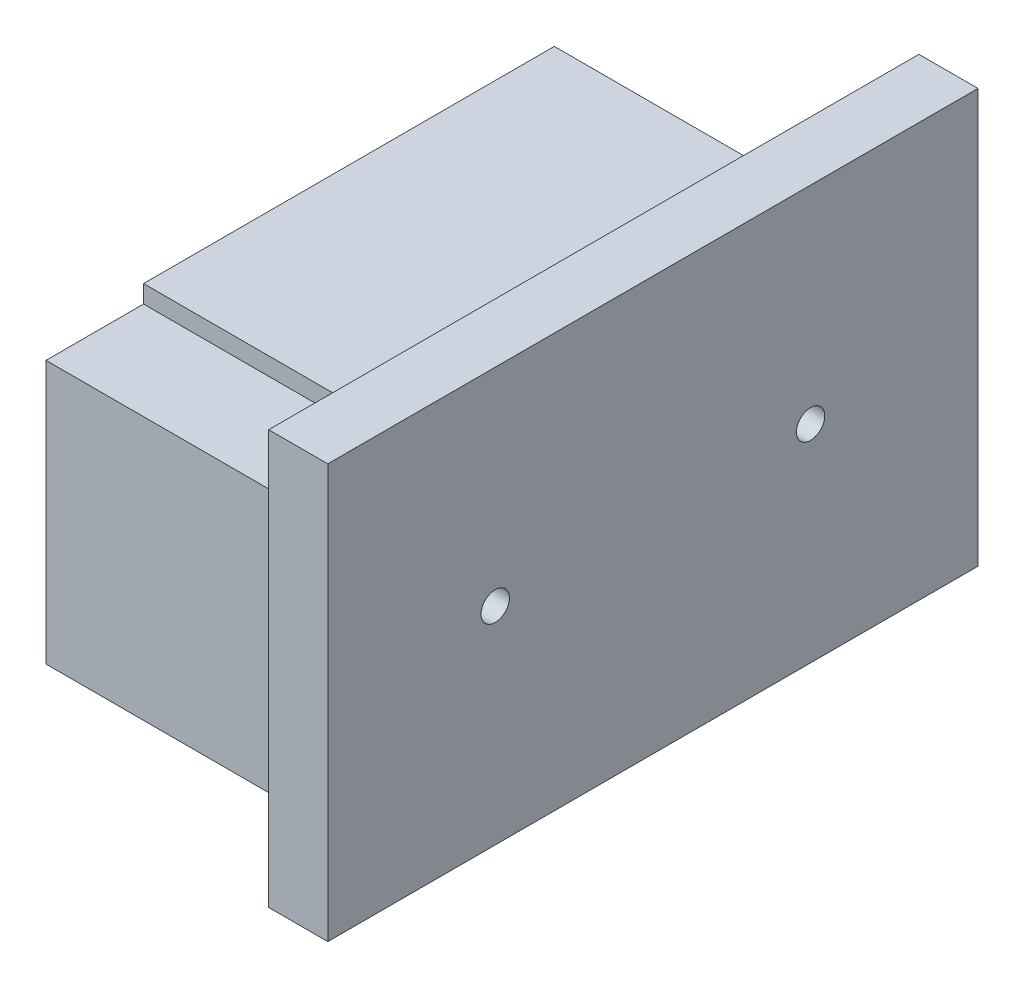
ISO-10303-21;
HEADER;
FILE_DESCRIPTION(('STEP AP214'),'2;1');
FILE_NAME('part.step','',(''),(''),'','','');
FILE_SCHEMA(('AUTOMOTIVE_DESIGN { 1 0 10303 214 1 1 1 1 }'));
ENDSEC;
DATA;
#1=APPLICATION_CONTEXT('core data for automotive mechanical design processes');
#2=APPLICATION_PROTOCOL_DEFINITION('international standard','automotive_design',2000,#1);
#3=PRODUCT_CONTEXT('',#1,'mechanical');
#4=PRODUCT('Part','Part','',(#3));
#5=PRODUCT_RELATED_PRODUCT_CATEGORY('part','',(#4));
#6=PRODUCT_DEFINITION_FORMATION('','',#4);
#7=PRODUCT_DEFINITION_CONTEXT('part definition',#1,'design');
#8=PRODUCT_DEFINITION('design','',#6,#7);
#9=PRODUCT_DEFINITION_SHAPE('','',#8);
#10=(LENGTH_UNIT() NAMED_UNIT(*) SI_UNIT(.MILLI.,.METRE.));
#11=(NAMED_UNIT(*) PLANE_ANGLE_UNIT() SI_UNIT($,.RADIAN.));
#12=(NAMED_UNIT(*) SI_UNIT($,.STERADIAN.) SOLID_ANGLE_UNIT());
#13=UNCERTAINTY_MEASURE_WITH_UNIT(LENGTH_MEASURE(1.E-05),#10,'distance_accuracy_value','');
#14=(GEOMETRIC_REPRESENTATION_CONTEXT(3) GLOBAL_UNCERTAINTY_ASSIGNED_CONTEXT((#13)) GLOBAL_UNIT_ASSIGNED_CONTEXT((#10,
#11,#12)) REPRESENTATION_CONTEXT('',''));
#15=CARTESIAN_POINT('',(0.,0.,0.));
#16=DIRECTION('',(0.,0.,1.));
#17=DIRECTION('',(1.,0.,0.));
#18=AXIS2_PLACEMENT_3D('',#15,#16,#17);
#19=CARTESIAN_POINT('',(32.,-10.5,0.));
#20=DIRECTION('',(0.,1.,0.));
#21=DIRECTION('',(0.,0.,1.));
#22=AXIS2_PLACEMENT_3D('',#19,#20,#21);
#23=PLANE('',#22);
#24=DIRECTION('',(0.,0.,-1.));
#25=VECTOR('',#24,1.);
#26=CARTESIAN_POINT('',(22.,-10.5,0.));
#27=LINE('',#26,#25);
#28=CARTESIAN_POINT('',(22.,-10.5,53.325));
#29=VERTEX_POINT('',#28);
#30=CARTESIAN_POINT('',(22.,-10.5,-56.675));
#31=VERTEX_POINT('',#30);
#32=EDGE_CURVE('E152',#29,#31,#27,.T.);
#33=ORIENTED_EDGE('',*,*,#32,.T.);
#34=DIRECTION('',(-1.,0.,0.));
#35=VECTOR('',#34,1.);
#36=CARTESIAN_POINT('',(32.,-10.5,-56.675));
#37=LINE('',#36,#35);
#38=CARTESIAN_POINT('',(32.,-10.5,-56.675));
#39=VERTEX_POINT('',#38);
#40=EDGE_CURVE('E13',#39,#31,#37,.T.);
#41=ORIENTED_EDGE('',*,*,#40,.F.);
#42=DIRECTION('',(0.,0.,-1.));
#43=VECTOR('',#42,1.);
#44=CARTESIAN_POINT('',(32.,-10.5,0.));
#45=LINE('',#44,#43);
#46=CARTESIAN_POINT('',(32.,-10.5,53.325));
#47=VERTEX_POINT('',#46);
#48=EDGE_CURVE('E99',#47,#39,#45,.T.);
#49=ORIENTED_EDGE('',*,*,#48,.F.);
#50=DIRECTION('',(-1.,0.,0.));
#51=VECTOR('',#50,1.);
#52=CARTESIAN_POINT('',(32.,-10.5,53.325));
#53=LINE('',#52,#51);
#54=EDGE_CURVE('E66',#47,#29,#53,.T.);
#55=ORIENTED_EDGE('',*,*,#54,.T.);
#56=EDGE_LOOP('',(#33,#41,#49,#55));
#57=FACE_BOUND('',#56,.T.);
#58=ADVANCED_FACE('F48',(#57),#23,.F.);
#59=CARTESIAN_POINT('',(32.,0.,-56.675));
#60=DIRECTION('',(0.,0.,1.));
#61=DIRECTION('',(1.,0.,0.));
#62=AXIS2_PLACEMENT_3D('',#59,#60,#61);
#63=PLANE('',#62);
#64=DIRECTION('',(0.,1.,0.));
#65=VECTOR('',#64,1.);
#66=CARTESIAN_POINT('',(22.,0.,-56.675));
#67=LINE('',#66,#65);
#68=CARTESIAN_POINT('',(22.,59.5,-56.675));
#69=VERTEX_POINT('',#68);
#70=EDGE_CURVE('E104',#31,#69,#67,.T.);
#71=ORIENTED_EDGE('',*,*,#70,.T.);
#72=DIRECTION('',(-1.,0.,0.));
#73=VECTOR('',#72,1.);
#74=CARTESIAN_POINT('',(32.,59.5,-56.675));
#75=LINE('',#74,#73);
#76=CARTESIAN_POINT('',(32.,59.5,-56.675));
#77=VERTEX_POINT('',#76);
#78=EDGE_CURVE('E57',#77,#69,#75,.T.);
#79=ORIENTED_EDGE('',*,*,#78,.F.);
#80=DIRECTION('',(0.,1.,0.));
#81=VECTOR('',#80,1.);
#82=CARTESIAN_POINT('',(32.,0.,-56.675));
#83=LINE('',#82,#81);
#84=EDGE_CURVE('E91',#39,#77,#83,.T.);
#85=ORIENTED_EDGE('',*,*,#84,.F.);
#86=ORIENTED_EDGE('',*,*,#40,.T.);
#87=EDGE_LOOP('',(#71,#79,#85,#86));
#88=FACE_BOUND('',#87,.T.);
#89=ADVANCED_FACE('F103',(#88),#63,.F.);
#90=CARTESIAN_POINT('',(32.,59.5,0.));
#91=DIRECTION('',(0.,1.,0.));
#92=DIRECTION('',(0.,0.,1.));
#93=AXIS2_PLACEMENT_3D('',#90,#91,#92);
#94=PLANE('',#93);
#95=DIRECTION('',(0.,0.,-1.));
#96=VECTOR('',#95,1.);
#97=CARTESIAN_POINT('',(22.,59.5,0.));
#98=LINE('',#97,#96);
#99=CARTESIAN_POINT('',(22.,59.5,53.325));
#100=VERTEX_POINT('',#99);
#101=EDGE_CURVE('E155',#100,#69,#98,.T.);
#102=ORIENTED_EDGE('',*,*,#101,.F.);
#103=DIRECTION('',(-1.,0.,0.));
#104=VECTOR('',#103,1.);
#105=CARTESIAN_POINT('',(32.,59.5,53.325));
#106=LINE('',#105,#104);
#107=CARTESIAN_POINT('',(32.,59.5,53.325));
#108=VERTEX_POINT('',#107);
#109=EDGE_CURVE('E80',#108,#100,#106,.T.);
#110=ORIENTED_EDGE('',*,*,#109,.F.);
#111=DIRECTION('',(0.,0.,-1.));
#112=VECTOR('',#111,1.);
#113=CARTESIAN_POINT('',(32.,59.5,0.));
#114=LINE('',#113,#112);
#115=EDGE_CURVE('E98',#108,#77,#114,.T.);
#116=ORIENTED_EDGE('',*,*,#115,.T.);
#117=ORIENTED_EDGE('',*,*,#78,.T.);
#118=EDGE_LOOP('',(#102,#110,#116,#117));
#119=FACE_BOUND('',#118,.T.);
#120=ADVANCED_FACE('F108',(#119),#94,.T.);
#121=CARTESIAN_POINT('',(32.,0.,53.325));
#122=DIRECTION('',(0.,0.,1.));
#123=DIRECTION('',(1.,0.,0.));
#124=AXIS2_PLACEMENT_3D('',#121,#122,#123);
#125=PLANE('',#124);
#126=DIRECTION('',(0.,1.,0.));
#127=VECTOR('',#126,1.);
#128=CARTESIAN_POINT('',(22.,0.,53.325));
#129=LINE('',#128,#127);
#130=EDGE_CURVE('E122',#29,#100,#129,.T.);
#131=ORIENTED_EDGE('',*,*,#130,.F.);
#132=ORIENTED_EDGE('',*,*,#54,.F.);
#133=DIRECTION('',(0.,1.,0.));
#134=VECTOR('',#133,1.);
#135=CARTESIAN_POINT('',(32.,0.,53.325));
#136=LINE('',#135,#134);
#137=EDGE_CURVE('E109',#47,#108,#136,.T.);
#138=ORIENTED_EDGE('',*,*,#137,.T.);
#139=ORIENTED_EDGE('',*,*,#109,.T.);
#140=EDGE_LOOP('',(#131,#132,#138,#139));
#141=FACE_BOUND('',#140,.T.);
#142=ADVANCED_FACE('F162',(#141),#125,.T.);
#143=CARTESIAN_POINT('',(32.,0.,0.));
#144=DIRECTION('',(1.,0.,0.));
#145=DIRECTION('',(0.,0.,-1.));
#146=AXIS2_PLACEMENT_3D('',#143,#144,#145);
#147=PLANE('',#146);
#148=CARTESIAN_POINT('',(32.,24.5,-28.35));
#149=DIRECTION('',(1.,0.,0.));
#150=DIRECTION('',(0.,0.,-1.));
#151=AXIS2_PLACEMENT_3D('',#148,#149,#150);
#152=CIRCLE('',#151,2.4);
#153=CARTESIAN_POINT('',(32.,24.5,-30.75));
#154=VERTEX_POINT('',#153);
#155=EDGE_CURVE('E128',#154,#154,#152,.T.);
#156=ORIENTED_EDGE('',*,*,#155,.F.);
#157=EDGE_LOOP('',(#156));
#158=FACE_BOUND('',#157,.T.);
#159=CARTESIAN_POINT('',(32.,24.5,25.));
#160=DIRECTION('',(1.,0.,0.));
#161=DIRECTION('',(0.,0.,-1.));
#162=AXIS2_PLACEMENT_3D('',#159,#160,#161);
#163=CIRCLE('',#162,2.4);
#164=CARTESIAN_POINT('',(32.,24.5,22.6));
#165=VERTEX_POINT('',#164);
#166=EDGE_CURVE('E123',#165,#165,#163,.T.);
#167=ORIENTED_EDGE('',*,*,#166,.F.);
#168=EDGE_LOOP('',(#167));
#169=FACE_BOUND('',#168,.T.);
#170=ORIENTED_EDGE('',*,*,#48,.T.);
#171=ORIENTED_EDGE('',*,*,#84,.T.);
#172=ORIENTED_EDGE('',*,*,#115,.F.);
#173=ORIENTED_EDGE('',*,*,#137,.F.);
#174=EDGE_LOOP('',(#170,#171,#172,#173));
#175=FACE_BOUND('',#174,.T.);
#176=ADVANCED_FACE('F95',(#158,#169,#175),#147,.T.);
#177=CARTESIAN_POINT('',(22.,0.,0.));
#178=DIRECTION('',(1.,0.,0.));
#179=DIRECTION('',(0.,0.,-1.));
#180=AXIS2_PLACEMENT_3D('',#177,#178,#179);
#181=PLANE('',#180);
#182=CARTESIAN_POINT('',(22.,24.5,-28.35));
#183=DIRECTION('',(1.,0.,0.));
#184=DIRECTION('',(0.,0.,-1.));
#185=AXIS2_PLACEMENT_3D('',#182,#183,#184);
#186=CIRCLE('',#185,2.4);
#187=CARTESIAN_POINT('',(22.,24.5,-30.75));
#188=VERTEX_POINT('',#187);
#189=EDGE_CURVE('E51',#188,#188,#186,.T.);
#190=ORIENTED_EDGE('',*,*,#189,.T.);
#191=EDGE_LOOP('',(#190));
#192=FACE_BOUND('',#191,.T.);
#193=CARTESIAN_POINT('',(22.,24.5,25.));
#194=DIRECTION('',(1.,0.,0.));
#195=DIRECTION('',(0.,0.,-1.));
#196=AXIS2_PLACEMENT_3D('',#193,#194,#195);
#197=CIRCLE('',#196,2.4);
#198=CARTESIAN_POINT('',(22.,24.5,22.6));
#199=VERTEX_POINT('',#198);
#200=EDGE_CURVE('E127',#199,#199,#197,.T.);
#201=ORIENTED_EDGE('',*,*,#200,.T.);
#202=EDGE_LOOP('',(#201));
#203=FACE_BOUND('',#202,.T.);
#204=ORIENTED_EDGE('',*,*,#32,.F.);
#205=ORIENTED_EDGE('',*,*,#130,.T.);
#206=ORIENTED_EDGE('',*,*,#101,.T.);
#207=ORIENTED_EDGE('',*,*,#70,.F.);
#208=EDGE_LOOP('',(#204,#205,#206,#207));
#209=FACE_BOUND('',#208,.T.);
#210=ADVANCED_FACE('F136',(#192,#203,#209),#181,.F.);
#211=CARTESIAN_POINT('',(-22.,24.5,25.));
#212=DIRECTION('',(1.,0.,0.));
#213=DIRECTION('',(0.,0.,-1.));
#214=AXIS2_PLACEMENT_3D('',#211,#212,#213);
#215=CYLINDRICAL_SURFACE('',#214,2.4);
#216=ORIENTED_EDGE('',*,*,#166,.T.);
#217=EDGE_LOOP('',(#216));
#218=FACE_BOUND('',#217,.T.);
#219=ORIENTED_EDGE('',*,*,#200,.F.);
#220=EDGE_LOOP('',(#219));
#221=FACE_BOUND('',#220,.T.);
#222=ADVANCED_FACE('F141',(#218,#221),#215,.F.);
#223=CARTESIAN_POINT('',(-22.,24.5,-28.35));
#224=DIRECTION('',(1.,0.,0.));
#225=DIRECTION('',(0.,0.,-1.));
#226=AXIS2_PLACEMENT_3D('',#223,#224,#225);
#227=CYLINDRICAL_SURFACE('',#226,2.4);
#228=ORIENTED_EDGE('',*,*,#155,.T.);
#229=EDGE_LOOP('',(#228));
#230=FACE_BOUND('',#229,.T.);
#231=ORIENTED_EDGE('',*,*,#189,.F.);
#232=EDGE_LOOP('',(#231));
#233=FACE_BOUND('',#232,.T.);
#234=ADVANCED_FACE('F139',(#230,#233),#227,.F.);
#235=CLOSED_SHELL('',(#58,#89,#120,#142,#176,#210,#222,#234));
#236=MANIFOLD_SOLID_BREP('B2',#235);
#237=CARTESIAN_POINT('',(-22.,47.5,-47.));
#238=DIRECTION('',(0.,0.,1.));
#239=DIRECTION('',(1.,0.,0.));
#240=AXIS2_PLACEMENT_3D('',#237,#238,#239);
#241=PLANE('',#240);
#242=DIRECTION('',(0.,-1.,0.));
#243=VECTOR('',#242,1.);
#244=CARTESIAN_POINT('',(22.,47.5,-47.));
#245=LINE('',#244,#243);
#246=CARTESIAN_POINT('',(22.,20.8699173563127,-47.));
#247=VERTEX_POINT('',#246);
#248=CARTESIAN_POINT('',(22.,3.,-47.));
#249=VERTEX_POINT('',#248);
#250=EDGE_CURVE('E319',#247,#249,#245,.T.);
#251=ORIENTED_EDGE('',*,*,#250,.T.);
#252=DIRECTION('',(1.,0.,0.));
#253=VECTOR('',#252,1.);
#254=CARTESIAN_POINT('',(-22.,3.,-47.));
#255=LINE('',#254,#253);
#256=CARTESIAN_POINT('',(-22.,3.,-47.));
#257=VERTEX_POINT('',#256);
#258=EDGE_CURVE('E304',#257,#249,#255,.T.);
#259=ORIENTED_EDGE('',*,*,#258,.F.);
#260=DIRECTION('',(0.,-1.,0.));
#261=VECTOR('',#260,1.);
#262=CARTESIAN_POINT('',(-22.,47.5,-47.));
#263=LINE('',#262,#261);
#264=CARTESIAN_POINT('',(-22.,20.8699173563127,-47.));
#265=VERTEX_POINT('',#264);
#266=EDGE_CURVE('E317',#265,#257,#263,.T.);
#267=ORIENTED_EDGE('',*,*,#266,.F.);
#268=DIRECTION('',(1.,0.,0.));
#269=VECTOR('',#268,1.);
#270=CARTESIAN_POINT('',(-22.,20.8699173563127,-47.));
#271=LINE('',#270,#269);
#272=EDGE_CURVE('E335',#265,#247,#271,.T.);
#273=ORIENTED_EDGE('',*,*,#272,.T.);
#274=EDGE_LOOP('',(#251,#259,#267,#273));
#275=FACE_BOUND('',#274,.T.);
#276=ADVANCED_FACE('F223',(#275),#241,.F.);
#277=CARTESIAN_POINT('',(22.,47.5,47.));
#278=DIRECTION('',(-1.,0.,0.));
#279=DIRECTION('',(0.,0.,1.));
#280=AXIS2_PLACEMENT_3D('',#277,#278,#279);
#281=PLANE('',#280);
#282=CARTESIAN_POINT('',(22.,24.5,25.));
#283=DIRECTION('',(1.,0.,0.));
#284=DIRECTION('',(0.,0.,-1.));
#285=AXIS2_PLACEMENT_3D('',#282,#283,#284);
#286=CIRCLE('',#285,19.);
#287=CARTESIAN_POINT('',(22.,24.5,6.));
#288=VERTEX_POINT('',#287);
#289=EDGE_CURVE('E345',#288,#288,#286,.T.);
#290=ORIENTED_EDGE('',*,*,#289,.F.);
#291=EDGE_LOOP('',(#290));
#292=FACE_BOUND('',#291,.T.);
#293=DIRECTION('',(0.,0.,-1.));
#294=VECTOR('',#293,1.);
#295=CARTESIAN_POINT('',(22.,0.,47.));
#296=LINE('',#295,#294);
#297=CARTESIAN_POINT('',(22.,0.,47.));
#298=VERTEX_POINT('',#297);
#299=CARTESIAN_POINT('',(22.,0.,-45.));
#300=VERTEX_POINT('',#299);
#301=EDGE_CURVE('E344',#298,#300,#296,.T.);
#302=ORIENTED_EDGE('',*,*,#301,.T.);
#303=DIRECTION('',(0.,-1.,0.));
#304=VECTOR('',#303,1.);
#305=CARTESIAN_POINT('',(22.,0.,-45.));
#306=LINE('',#305,#304);
#307=CARTESIAN_POINT('',(22.,3.,-45.));
#308=VERTEX_POINT('',#307);
#309=EDGE_CURVE('E248',#308,#300,#306,.T.);
#310=ORIENTED_EDGE('',*,*,#309,.F.);
#311=DIRECTION('',(0.,0.,1.));
#312=VECTOR('',#311,1.);
#313=CARTESIAN_POINT('',(22.,3.,-47.));
#314=LINE('',#313,#312);
#315=EDGE_CURVE('E370',#249,#308,#314,.T.);
#316=ORIENTED_EDGE('',*,*,#315,.F.);
#317=ORIENTED_EDGE('',*,*,#250,.F.);
#318=CARTESIAN_POINT('',(22.,24.5,-28.35));
#319=DIRECTION('',(1.,0.,0.));
#320=DIRECTION('',(0.,0.,-1.));
#321=AXIS2_PLACEMENT_3D('',#318,#319,#320);
#322=CIRCLE('',#321,19.);
#323=CARTESIAN_POINT('',(22.,40.234595641452,-39.));
#324=VERTEX_POINT('',#323);
#325=EDGE_CURVE('E227',#324,#247,#322,.T.);
#326=ORIENTED_EDGE('',*,*,#325,.F.);
#327=DIRECTION('',(0.,-1.,0.));
#328=VECTOR('',#327,1.);
#329=CARTESIAN_POINT('',(22.,47.5,-39.));
#330=LINE('',#329,#328);
#331=CARTESIAN_POINT('',(22.,47.5,-39.));
#332=VERTEX_POINT('',#331);
#333=EDGE_CURVE('E46',#332,#324,#330,.T.);
#334=ORIENTED_EDGE('',*,*,#333,.F.);
#335=DIRECTION('',(0.,0.,-1.));
#336=VECTOR('',#335,1.);
#337=CARTESIAN_POINT('',(22.,47.5,47.));
#338=LINE('',#337,#336);
#339=CARTESIAN_POINT('',(22.,47.5,30.5));
#340=VERTEX_POINT('',#339);
#341=EDGE_CURVE('E350',#340,#332,#338,.T.);
#342=ORIENTED_EDGE('',*,*,#341,.F.);
#343=DIRECTION('',(0.,1.,0.));
#344=VECTOR('',#343,1.);
#345=CARTESIAN_POINT('',(22.,47.5,30.5));
#346=LINE('',#345,#344);
#347=CARTESIAN_POINT('',(22.,44.5,30.5));
#348=VERTEX_POINT('',#347);
#349=EDGE_CURVE('E240',#348,#340,#346,.T.);
#350=ORIENTED_EDGE('',*,*,#349,.F.);
#351=DIRECTION('',(0.,0.,-1.));
#352=VECTOR('',#351,1.);
#353=CARTESIAN_POINT('',(22.,44.5,47.));
#354=LINE('',#353,#352);
#355=CARTESIAN_POINT('',(22.,44.5,47.));
#356=VERTEX_POINT('',#355);
#357=EDGE_CURVE('E373',#356,#348,#354,.T.);
#358=ORIENTED_EDGE('',*,*,#357,.F.);
#359=DIRECTION('',(0.,-1.,0.));
#360=VECTOR('',#359,1.);
#361=CARTESIAN_POINT('',(22.,47.5,47.));
#362=LINE('',#361,#360);
#363=EDGE_CURVE('E334',#356,#298,#362,.T.);
#364=ORIENTED_EDGE('',*,*,#363,.T.);
#365=EDGE_LOOP('',(#302,#310,#316,#317,#326,#334,#342,#350,#358,#364));
#366=FACE_BOUND('',#365,.T.);
#367=ADVANCED_FACE('F225',(#292,#366),#281,.F.);
#368=CARTESIAN_POINT('',(-22.,47.5,47.));
#369=DIRECTION('',(1.,0.,0.));
#370=DIRECTION('',(0.,0.,-1.));
#371=AXIS2_PLACEMENT_3D('',#368,#369,#370);
#372=PLANE('',#371);
#373=CARTESIAN_POINT('',(-22.,24.5,25.));
#374=DIRECTION('',(1.,0.,0.));
#375=DIRECTION('',(0.,0.,-1.));
#376=AXIS2_PLACEMENT_3D('',#373,#374,#375);
#377=CIRCLE('',#376,19.);
#378=CARTESIAN_POINT('',(-22.,24.5,6.));
#379=VERTEX_POINT('',#378);
#380=EDGE_CURVE('E336',#379,#379,#377,.T.);
#381=ORIENTED_EDGE('',*,*,#380,.T.);
#382=EDGE_LOOP('',(#381));
#383=FACE_BOUND('',#382,.T.);
#384=DIRECTION('',(0.,0.,1.));
#385=VECTOR('',#384,1.);
#386=CARTESIAN_POINT('',(-22.,3.,-47.));
#387=LINE('',#386,#385);
#388=CARTESIAN_POINT('',(-22.,3.,-45.));
#389=VERTEX_POINT('',#388);
#390=EDGE_CURVE('E300',#257,#389,#387,.T.);
#391=ORIENTED_EDGE('',*,*,#390,.T.);
#392=DIRECTION('',(0.,-1.,0.));
#393=VECTOR('',#392,1.);
#394=CARTESIAN_POINT('',(-22.,0.,-45.));
#395=LINE('',#394,#393);
#396=CARTESIAN_POINT('',(-22.,0.,-45.));
#397=VERTEX_POINT('',#396);
#398=EDGE_CURVE('E311',#389,#397,#395,.T.);
#399=ORIENTED_EDGE('',*,*,#398,.T.);
#400=DIRECTION('',(0.,0.,1.));
#401=VECTOR('',#400,1.);
#402=CARTESIAN_POINT('',(-22.,0.,47.));
#403=LINE('',#402,#401);
#404=CARTESIAN_POINT('',(-22.,0.,47.));
#405=VERTEX_POINT('',#404);
#406=EDGE_CURVE('E326',#397,#405,#403,.T.);
#407=ORIENTED_EDGE('',*,*,#406,.T.);
#408=DIRECTION('',(0.,-1.,0.));
#409=VECTOR('',#408,1.);
#410=CARTESIAN_POINT('',(-22.,47.5,47.));
#411=LINE('',#410,#409);
#412=CARTESIAN_POINT('',(-22.,44.5,47.));
#413=VERTEX_POINT('',#412);
#414=EDGE_CURVE('E352',#413,#405,#411,.T.);
#415=ORIENTED_EDGE('',*,*,#414,.F.);
#416=DIRECTION('',(0.,0.,-1.));
#417=VECTOR('',#416,1.);
#418=CARTESIAN_POINT('',(-22.,44.5,47.));
#419=LINE('',#418,#417);
#420=CARTESIAN_POINT('',(-22.,44.5,30.5));
#421=VERTEX_POINT('',#420);
#422=EDGE_CURVE('E372',#413,#421,#419,.T.);
#423=ORIENTED_EDGE('',*,*,#422,.T.);
#424=DIRECTION('',(0.,1.,0.));
#425=VECTOR('',#424,1.);
#426=CARTESIAN_POINT('',(-22.,47.5,30.5));
#427=LINE('',#426,#425);
#428=CARTESIAN_POINT('',(-22.,47.5,30.5));
#429=VERTEX_POINT('',#428);
#430=EDGE_CURVE('E366',#421,#429,#427,.T.);
#431=ORIENTED_EDGE('',*,*,#430,.T.);
#432=DIRECTION('',(0.,0.,1.));
#433=VECTOR('',#432,1.);
#434=CARTESIAN_POINT('',(-22.,47.5,47.));
#435=LINE('',#434,#433);
#436=CARTESIAN_POINT('',(-22.,47.5,-39.));
#437=VERTEX_POINT('',#436);
#438=EDGE_CURVE('E349',#437,#429,#435,.T.);
#439=ORIENTED_EDGE('',*,*,#438,.F.);
#440=DIRECTION('',(0.,-1.,0.));
#441=VECTOR('',#440,1.);
#442=CARTESIAN_POINT('',(-22.,47.5,-39.));
#443=LINE('',#442,#441);
#444=CARTESIAN_POINT('',(-22.,40.234595641452,-39.));
#445=VERTEX_POINT('',#444);
#446=EDGE_CURVE('E331',#437,#445,#443,.T.);
#447=ORIENTED_EDGE('',*,*,#446,.T.);
#448=CARTESIAN_POINT('',(-22.,24.5,-28.35));
#449=DIRECTION('',(1.,0.,0.));
#450=DIRECTION('',(0.,0.,-1.));
#451=AXIS2_PLACEMENT_3D('',#448,#449,#450);
#452=CIRCLE('',#451,19.);
#453=EDGE_CURVE('E324',#445,#265,#452,.T.);
#454=ORIENTED_EDGE('',*,*,#453,.T.);
#455=ORIENTED_EDGE('',*,*,#266,.T.);
#456=EDGE_LOOP('',(#391,#399,#407,#415,#423,#431,#439,#447,#454,#455));
#457=FACE_BOUND('',#456,.T.);
#458=ADVANCED_FACE('F321',(#383,#457),#372,.F.);
#459=CARTESIAN_POINT('',(-22.,47.5,47.));
#460=DIRECTION('',(0.,0.,-1.));
#461=DIRECTION('',(-1.,0.,0.));
#462=AXIS2_PLACEMENT_3D('',#459,#460,#461);
#463=PLANE('',#462);
#464=ORIENTED_EDGE('',*,*,#363,.F.);
#465=DIRECTION('',(1.,0.,0.));
#466=VECTOR('',#465,1.);
#467=CARTESIAN_POINT('',(-22.,44.5,47.));
#468=LINE('',#467,#466);
#469=EDGE_CURVE('E363',#413,#356,#468,.T.);
#470=ORIENTED_EDGE('',*,*,#469,.F.);
#471=ORIENTED_EDGE('',*,*,#414,.T.);
#472=DIRECTION('',(1.,0.,0.));
#473=VECTOR('',#472,1.);
#474=CARTESIAN_POINT('',(-22.,0.,47.));
#475=LINE('',#474,#473);
#476=EDGE_CURVE('E329',#405,#298,#475,.T.);
#477=ORIENTED_EDGE('',*,*,#476,.T.);
#478=EDGE_LOOP('',(#464,#470,#471,#477));
#479=FACE_BOUND('',#478,.T.);
#480=ADVANCED_FACE('F392',(#479),#463,.F.);
#481=CARTESIAN_POINT('',(0.,47.5,0.));
#482=DIRECTION('',(0.,-1.,0.));
#483=DIRECTION('',(0.,0.,-1.));
#484=AXIS2_PLACEMENT_3D('',#481,#482,#483);
#485=PLANE('',#484);
#486=ORIENTED_EDGE('',*,*,#438,.T.);
#487=DIRECTION('',(1.,0.,0.));
#488=VECTOR('',#487,1.);
#489=CARTESIAN_POINT('',(-22.,47.5,30.5));
#490=LINE('',#489,#488);
#491=EDGE_CURVE('E368',#429,#340,#490,.T.);
#492=ORIENTED_EDGE('',*,*,#491,.T.);
#493=ORIENTED_EDGE('',*,*,#341,.T.);
#494=DIRECTION('',(1.,0.,0.));
#495=VECTOR('',#494,1.);
#496=CARTESIAN_POINT('',(-22.,47.5,-39.));
#497=LINE('',#496,#495);
#498=EDGE_CURVE('E232',#437,#332,#497,.T.);
#499=ORIENTED_EDGE('',*,*,#498,.F.);
#500=EDGE_LOOP('',(#486,#492,#493,#499));
#501=FACE_BOUND('',#500,.T.);
#502=ADVANCED_FACE('F402',(#501),#485,.F.);
#503=CARTESIAN_POINT('',(0.,0.,0.));
#504=DIRECTION('',(0.,-1.,0.));
#505=DIRECTION('',(0.,0.,-1.));
#506=AXIS2_PLACEMENT_3D('',#503,#504,#505);
#507=PLANE('',#506);
#508=DIRECTION('',(1.,0.,0.));
#509=VECTOR('',#508,1.);
#510=CARTESIAN_POINT('',(-22.,0.,-45.));
#511=LINE('',#510,#509);
#512=EDGE_CURVE('E341',#397,#300,#511,.T.);
#513=ORIENTED_EDGE('',*,*,#512,.T.);
#514=ORIENTED_EDGE('',*,*,#301,.F.);
#515=ORIENTED_EDGE('',*,*,#476,.F.);
#516=ORIENTED_EDGE('',*,*,#406,.F.);
#517=EDGE_LOOP('',(#513,#514,#515,#516));
#518=FACE_BOUND('',#517,.T.);
#519=ADVANCED_FACE('F388',(#518),#507,.T.);
#520=CARTESIAN_POINT('',(-22.,24.5,25.));
#521=DIRECTION('',(1.,0.,0.));
#522=DIRECTION('',(0.,0.,-1.));
#523=AXIS2_PLACEMENT_3D('',#520,#521,#522);
#524=CYLINDRICAL_SURFACE('',#523,19.);
#525=ORIENTED_EDGE('',*,*,#380,.F.);
#526=EDGE_LOOP('',(#525));
#527=FACE_BOUND('',#526,.T.);
#528=ORIENTED_EDGE('',*,*,#289,.T.);
#529=EDGE_LOOP('',(#528));
#530=FACE_BOUND('',#529,.T.);
#531=ADVANCED_FACE('F412',(#527,#530),#524,.F.);
#532=CARTESIAN_POINT('',(-22.,24.5,-28.35));
#533=DIRECTION('',(1.,0.,0.));
#534=DIRECTION('',(0.,0.,-1.));
#535=AXIS2_PLACEMENT_3D('',#532,#533,#534);
#536=CYLINDRICAL_SURFACE('',#535,19.);
#537=ORIENTED_EDGE('',*,*,#453,.F.);
#538=DIRECTION('',(1.,0.,0.));
#539=VECTOR('',#538,1.);
#540=CARTESIAN_POINT('',(-22.,40.234595641452,-39.));
#541=LINE('',#540,#539);
#542=EDGE_CURVE('E348',#445,#324,#541,.T.);
#543=ORIENTED_EDGE('',*,*,#542,.T.);
#544=ORIENTED_EDGE('',*,*,#325,.T.);
#545=ORIENTED_EDGE('',*,*,#272,.F.);
#546=EDGE_LOOP('',(#537,#543,#544,#545));
#547=FACE_BOUND('',#546,.T.);
#548=ADVANCED_FACE('F410',(#547),#536,.F.);
#549=CARTESIAN_POINT('',(-22.,47.5,-39.));
#550=DIRECTION('',(0.,0.,1.));
#551=DIRECTION('',(1.,0.,0.));
#552=AXIS2_PLACEMENT_3D('',#549,#550,#551);
#553=PLANE('',#552);
#554=ORIENTED_EDGE('',*,*,#446,.F.);
#555=ORIENTED_EDGE('',*,*,#498,.T.);
#556=ORIENTED_EDGE('',*,*,#333,.T.);
#557=ORIENTED_EDGE('',*,*,#542,.F.);
#558=EDGE_LOOP('',(#554,#555,#556,#557));
#559=FACE_BOUND('',#558,.T.);
#560=ADVANCED_FACE('F408',(#559),#553,.F.);
#561=CARTESIAN_POINT('',(-22.,0.,-45.));
#562=DIRECTION('',(0.,0.,1.));
#563=DIRECTION('',(1.,0.,0.));
#564=AXIS2_PLACEMENT_3D('',#561,#562,#563);
#565=PLANE('',#564);
#566=ORIENTED_EDGE('',*,*,#309,.T.);
#567=ORIENTED_EDGE('',*,*,#512,.F.);
#568=ORIENTED_EDGE('',*,*,#398,.F.);
#569=DIRECTION('',(1.,0.,0.));
#570=VECTOR('',#569,1.);
#571=CARTESIAN_POINT('',(-22.,3.,-45.));
#572=LINE('',#571,#570);
#573=EDGE_CURVE('E306',#389,#308,#572,.T.);
#574=ORIENTED_EDGE('',*,*,#573,.T.);
#575=EDGE_LOOP('',(#566,#567,#568,#574));
#576=FACE_BOUND('',#575,.T.);
#577=ADVANCED_FACE('F418',(#576),#565,.F.);
#578=CARTESIAN_POINT('',(-22.,3.,-47.));
#579=DIRECTION('',(0.,1.,0.));
#580=DIRECTION('',(0.,0.,1.));
#581=AXIS2_PLACEMENT_3D('',#578,#579,#580);
#582=PLANE('',#581);
#583=ORIENTED_EDGE('',*,*,#315,.T.);
#584=ORIENTED_EDGE('',*,*,#573,.F.);
#585=ORIENTED_EDGE('',*,*,#390,.F.);
#586=ORIENTED_EDGE('',*,*,#258,.T.);
#587=EDGE_LOOP('',(#583,#584,#585,#586));
#588=FACE_BOUND('',#587,.T.);
#589=ADVANCED_FACE('F303',(#588),#582,.F.);
#590=CARTESIAN_POINT('',(-22.,47.5,30.5));
#591=DIRECTION('',(0.,0.,-1.));
#592=DIRECTION('',(-1.,0.,0.));
#593=AXIS2_PLACEMENT_3D('',#590,#591,#592);
#594=PLANE('',#593);
#595=ORIENTED_EDGE('',*,*,#349,.T.);
#596=ORIENTED_EDGE('',*,*,#491,.F.);
#597=ORIENTED_EDGE('',*,*,#430,.F.);
#598=DIRECTION('',(1.,0.,0.));
#599=VECTOR('',#598,1.);
#600=CARTESIAN_POINT('',(-22.,44.5,30.5));
#601=LINE('',#600,#599);
#602=EDGE_CURVE('E365',#421,#348,#601,.T.);
#603=ORIENTED_EDGE('',*,*,#602,.T.);
#604=EDGE_LOOP('',(#595,#596,#597,#603));
#605=FACE_BOUND('',#604,.T.);
#606=ADVANCED_FACE('F399',(#605),#594,.F.);
#607=CARTESIAN_POINT('',(-22.,44.5,47.));
#608=DIRECTION('',(0.,-1.,0.));
#609=DIRECTION('',(0.,0.,-1.));
#610=AXIS2_PLACEMENT_3D('',#607,#608,#609);
#611=PLANE('',#610);
#612=ORIENTED_EDGE('',*,*,#357,.T.);
#613=ORIENTED_EDGE('',*,*,#602,.F.);
#614=ORIENTED_EDGE('',*,*,#422,.F.);
#615=ORIENTED_EDGE('',*,*,#469,.T.);
#616=EDGE_LOOP('',(#612,#613,#614,#615));
#617=FACE_BOUND('',#616,.T.);
#618=ADVANCED_FACE('F397',(#617),#611,.F.);
#619=CLOSED_SHELL('',(#276,#367,#458,#480,#502,#519,#531,#548,#560,#577,#589,#606,#618));
#620=MANIFOLD_SOLID_BREP('B7_NOT_SHOWN',#619);
#621=ADVANCED_BREP_SHAPE_REPRESENTATION('',(#18,#236,#620),#14);
#622=SHAPE_DEFINITION_REPRESENTATION(#9,#621);
ENDSEC;
END-ISO-10303-21;
